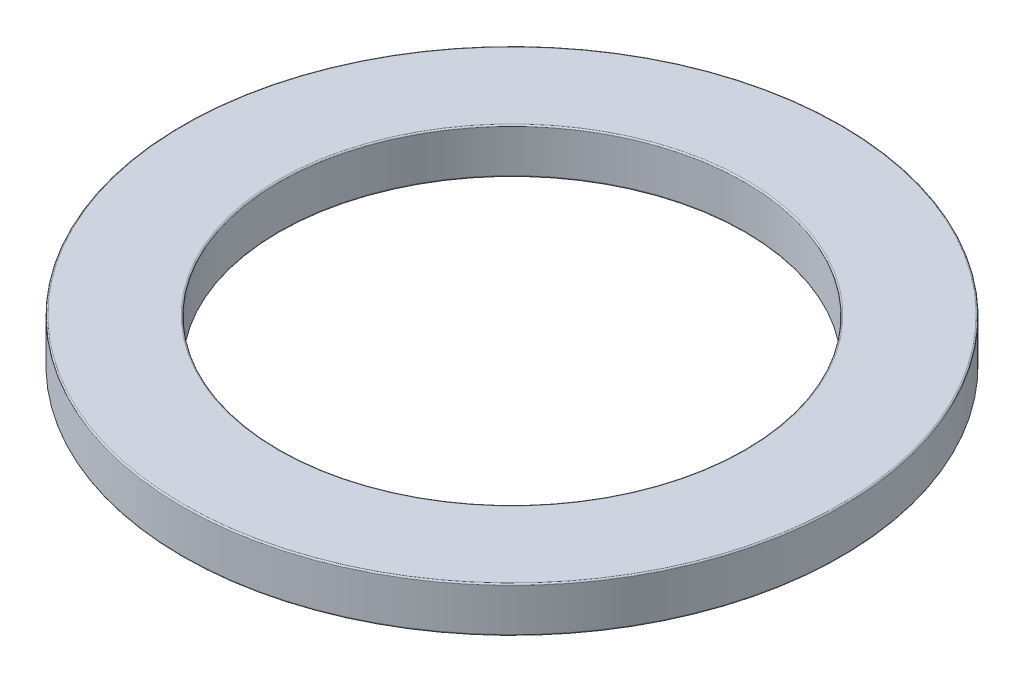
ISO-10303-21;
HEADER;
FILE_DESCRIPTION(('STEP AP214'),'2;1');
FILE_NAME('part.step','',(''),(''),'','','');
FILE_SCHEMA(('AUTOMOTIVE_DESIGN { 1 0 10303 214 1 1 1 1 }'));
ENDSEC;
DATA;
#1=APPLICATION_CONTEXT('core data for automotive mechanical design processes');
#2=APPLICATION_PROTOCOL_DEFINITION('international standard','automotive_design',2000,#1);
#3=PRODUCT_CONTEXT('',#1,'mechanical');
#4=PRODUCT('Part','Part','',(#3));
#5=PRODUCT_RELATED_PRODUCT_CATEGORY('part','',(#4));
#6=PRODUCT_DEFINITION_FORMATION('','',#4);
#7=PRODUCT_DEFINITION_CONTEXT('part definition',#1,'design');
#8=PRODUCT_DEFINITION('design','',#6,#7);
#9=PRODUCT_DEFINITION_SHAPE('','',#8);
#10=(LENGTH_UNIT() NAMED_UNIT(*) SI_UNIT(.MILLI.,.METRE.));
#11=(NAMED_UNIT(*) PLANE_ANGLE_UNIT() SI_UNIT($,.RADIAN.));
#12=(NAMED_UNIT(*) SI_UNIT($,.STERADIAN.) SOLID_ANGLE_UNIT());
#13=UNCERTAINTY_MEASURE_WITH_UNIT(LENGTH_MEASURE(1.E-05),#10,'distance_accuracy_value','');
#14=(GEOMETRIC_REPRESENTATION_CONTEXT(3) GLOBAL_UNCERTAINTY_ASSIGNED_CONTEXT((#13)) GLOBAL_UNIT_ASSIGNED_CONTEXT((#10,
#11,#12)) REPRESENTATION_CONTEXT('',''));
#15=CARTESIAN_POINT('',(0.,0.,0.));
#16=DIRECTION('',(0.,0.,1.));
#17=DIRECTION('',(1.,0.,0.));
#18=AXIS2_PLACEMENT_3D('',#15,#16,#17);
#19=CARTESIAN_POINT('',(0.,1.84996666666667,26.9875));
#20=DIRECTION('',(0.,-1.,0.));
#21=DIRECTION('',(0.,0.,-1.));
#22=AXIS2_PLACEMENT_3D('',#19,#20,#21);
#23=PLANE('',#22);
#24=CARTESIAN_POINT('',(0.,1.84996666666667,0.));
#25=DIRECTION('',(0.,1.,0.));
#26=DIRECTION('',(0.,0.,1.));
#27=AXIS2_PLACEMENT_3D('',#24,#25,#26);
#28=CIRCLE('',#27,26.876502);
#29=CARTESIAN_POINT('',(0.,1.84996666666667,26.876502));
#30=VERTEX_POINT('',#29);
#31=EDGE_CURVE('E33',#30,#30,#28,.T.);
#32=ORIENTED_EDGE('',*,*,#31,.F.);
#33=EDGE_LOOP('',(#32));
#34=FACE_BOUND('',#33,.T.);
#35=CARTESIAN_POINT('',(0.,1.84996666666667,0.));
#36=DIRECTION('',(0.,1.,0.));
#37=DIRECTION('',(0.,0.,1.));
#38=AXIS2_PLACEMENT_3D('',#35,#36,#37);
#39=CIRCLE('',#38,19.160998);
#40=CARTESIAN_POINT('',(0.,1.84996666666667,19.160998));
#41=VERTEX_POINT('',#40);
#42=EDGE_CURVE('E19',#41,#41,#39,.F.);
#43=ORIENTED_EDGE('',*,*,#42,.F.);
#44=EDGE_LOOP('',(#43));
#45=FACE_BOUND('',#44,.T.);
#46=ADVANCED_FACE('F15',(#34,#45),#23,.T.);
#47=CARTESIAN_POINT('',(0.,1.96096466666667,0.));
#48=DIRECTION('',(0.,1.,0.));
#49=DIRECTION('',(0.,0.,1.));
#50=AXIS2_PLACEMENT_3D('',#47,#48,#49);
#51=TOROIDAL_SURFACE('',#50,19.160998,0.110998);
#52=ORIENTED_EDGE('',*,*,#42,.T.);
#53=EDGE_LOOP('',(#52));
#54=FACE_BOUND('',#53,.T.);
#55=CARTESIAN_POINT('',(0.,1.96096466666667,0.));
#56=DIRECTION('',(0.,-1.,0.));
#57=DIRECTION('',(0.,0.,-1.));
#58=AXIS2_PLACEMENT_3D('',#55,#56,#57);
#59=CIRCLE('',#58,19.05);
#60=CARTESIAN_POINT('',(0.,1.96096466666667,-19.05));
#61=VERTEX_POINT('',#60);
#62=EDGE_CURVE('E31',#61,#61,#59,.F.);
#63=ORIENTED_EDGE('',*,*,#62,.T.);
#64=EDGE_LOOP('',(#63));
#65=FACE_BOUND('',#64,.T.);
#66=ADVANCED_FACE('F42',(#54,#65),#51,.T.);
#67=CARTESIAN_POINT('',(0.,1.96096466666666,0.));
#68=DIRECTION('',(0.,1.,0.));
#69=DIRECTION('',(0.,0.,1.));
#70=AXIS2_PLACEMENT_3D('',#67,#68,#69);
#71=TOROIDAL_SURFACE('',#70,26.876502,0.110997999999996);
#72=ORIENTED_EDGE('',*,*,#31,.T.);
#73=EDGE_LOOP('',(#72));
#74=FACE_BOUND('',#73,.T.);
#75=CARTESIAN_POINT('',(0.,1.96096466666667,0.));
#76=DIRECTION('',(0.,-1.,0.));
#77=DIRECTION('',(0.,0.,-1.));
#78=AXIS2_PLACEMENT_3D('',#75,#76,#77);
#79=CIRCLE('',#78,26.9875);
#80=CARTESIAN_POINT('',(0.,1.96096466666667,-26.9875));
#81=VERTEX_POINT('',#80);
#82=EDGE_CURVE('E38',#81,#81,#79,.F.);
#83=ORIENTED_EDGE('',*,*,#82,.F.);
#84=EDGE_LOOP('',(#83));
#85=FACE_BOUND('',#84,.T.);
#86=ADVANCED_FACE('F52',(#74,#85),#71,.T.);
#87=CARTESIAN_POINT('',(0.,-5.5499,0.));
#88=DIRECTION('',(0.,-1.,0.));
#89=DIRECTION('',(0.,0.,-1.));
#90=AXIS2_PLACEMENT_3D('',#87,#88,#89);
#91=CYLINDRICAL_SURFACE('',#90,19.05);
#92=CARTESIAN_POINT('',(0.,5.438902,0.));
#93=DIRECTION('',(0.,-1.,0.));
#94=DIRECTION('',(0.,0.,-1.));
#95=AXIS2_PLACEMENT_3D('',#92,#93,#94);
#96=CIRCLE('',#95,19.05);
#97=CARTESIAN_POINT('',(0.,5.438902,-19.05));
#98=VERTEX_POINT('',#97);
#99=EDGE_CURVE('E78',#98,#98,#96,.T.);
#100=ORIENTED_EDGE('',*,*,#99,.F.);
#101=EDGE_LOOP('',(#100));
#102=FACE_BOUND('',#101,.T.);
#103=ORIENTED_EDGE('',*,*,#62,.F.);
#104=EDGE_LOOP('',(#103));
#105=FACE_BOUND('',#104,.T.);
#106=ADVANCED_FACE('F67',(#102,#105),#91,.F.);
#107=CARTESIAN_POINT('',(0.,-5.5499,0.));
#108=DIRECTION('',(0.,-1.,0.));
#109=DIRECTION('',(0.,0.,-1.));
#110=AXIS2_PLACEMENT_3D('',#107,#108,#109);
#111=CYLINDRICAL_SURFACE('',#110,26.9875);
#112=CARTESIAN_POINT('',(0.,5.438902,0.));
#113=DIRECTION('',(0.,1.,0.));
#114=DIRECTION('',(0.,0.,1.));
#115=AXIS2_PLACEMENT_3D('',#112,#113,#114);
#116=CIRCLE('',#115,26.9875);
#117=CARTESIAN_POINT('',(0.,5.438902,26.9875));
#118=VERTEX_POINT('',#117);
#119=EDGE_CURVE('E28',#118,#118,#116,.T.);
#120=ORIENTED_EDGE('',*,*,#119,.F.);
#121=EDGE_LOOP('',(#120));
#122=FACE_BOUND('',#121,.T.);
#123=ORIENTED_EDGE('',*,*,#82,.T.);
#124=EDGE_LOOP('',(#123));
#125=FACE_BOUND('',#124,.T.);
#126=ADVANCED_FACE('F65',(#122,#125),#111,.T.);
#127=CARTESIAN_POINT('',(0.,5.438902,0.));
#128=DIRECTION('',(0.,-1.,0.));
#129=DIRECTION('',(0.,0.,-1.));
#130=AXIS2_PLACEMENT_3D('',#127,#128,#129);
#131=TOROIDAL_SURFACE('',#130,19.160998,0.110997999999999);
#132=CARTESIAN_POINT('',(0.,5.5499,0.));
#133=DIRECTION('',(0.,-1.,0.));
#134=DIRECTION('',(1.,0.,0.));
#135=AXIS2_PLACEMENT_3D('',#132,#133,#134);
#136=CIRCLE('',#135,19.160998);
#137=CARTESIAN_POINT('',(19.160998,5.5499,0.));
#138=VERTEX_POINT('',#137);
#139=EDGE_CURVE('E23',#138,#138,#136,.T.);
#140=ORIENTED_EDGE('',*,*,#139,.F.);
#141=EDGE_LOOP('',(#140));
#142=FACE_BOUND('',#141,.T.);
#143=ORIENTED_EDGE('',*,*,#99,.T.);
#144=EDGE_LOOP('',(#143));
#145=FACE_BOUND('',#144,.T.);
#146=ADVANCED_FACE('F61',(#142,#145),#131,.T.);
#147=CARTESIAN_POINT('',(0.,5.43890200000001,0.));
#148=DIRECTION('',(0.,-1.,0.));
#149=DIRECTION('',(0.,0.,-1.));
#150=AXIS2_PLACEMENT_3D('',#147,#148,#149);
#151=TOROIDAL_SURFACE('',#150,26.876502,0.110997999999996);
#152=CARTESIAN_POINT('',(0.,5.5499,0.));
#153=DIRECTION('',(0.,-1.,0.));
#154=DIRECTION('',(0.,0.,-1.));
#155=AXIS2_PLACEMENT_3D('',#152,#153,#154);
#156=CIRCLE('',#155,26.876502);
#157=CARTESIAN_POINT('',(0.,5.5499,-26.876502));
#158=VERTEX_POINT('',#157);
#159=EDGE_CURVE('E10',#158,#158,#156,.F.);
#160=ORIENTED_EDGE('',*,*,#159,.F.);
#161=EDGE_LOOP('',(#160));
#162=FACE_BOUND('',#161,.T.);
#163=ORIENTED_EDGE('',*,*,#119,.T.);
#164=EDGE_LOOP('',(#163));
#165=FACE_BOUND('',#164,.T.);
#166=ADVANCED_FACE('F17',(#162,#165),#151,.T.);
#167=CARTESIAN_POINT('',(0.,5.5499,26.9875));
#168=DIRECTION('',(0.,1.,0.));
#169=DIRECTION('',(0.,0.,1.));
#170=AXIS2_PLACEMENT_3D('',#167,#168,#169);
#171=PLANE('',#170);
#172=ORIENTED_EDGE('',*,*,#159,.T.);
#173=EDGE_LOOP('',(#172));
#174=FACE_BOUND('',#173,.T.);
#175=ORIENTED_EDGE('',*,*,#139,.T.);
#176=EDGE_LOOP('',(#175));
#177=FACE_BOUND('',#176,.T.);
#178=ADVANCED_FACE('F55',(#174,#177),#171,.T.);
#179=CLOSED_SHELL('',(#46,#66,#86,#106,#126,#146,#166,#178));
#180=MANIFOLD_SOLID_BREP('B1',#179);
#181=ADVANCED_BREP_SHAPE_REPRESENTATION('',(#18,#180),#14);
#182=SHAPE_DEFINITION_REPRESENTATION(#9,#181);
ENDSEC;
END-ISO-10303-21;
